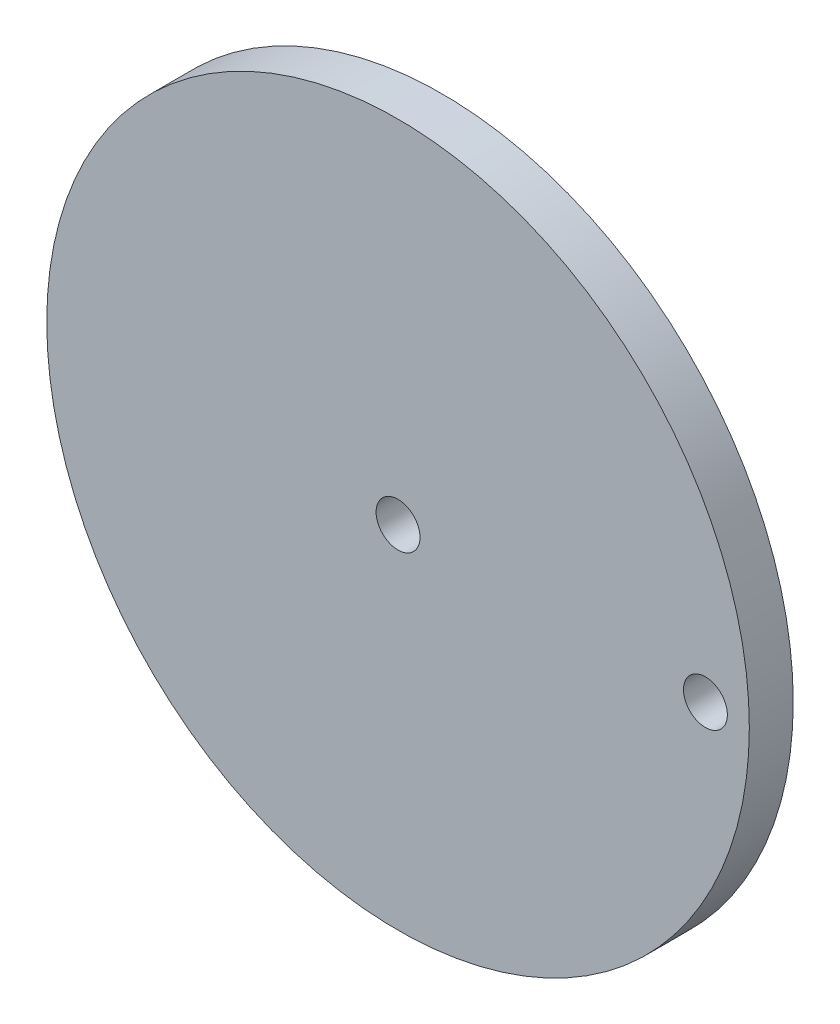
ISO-10303-21;
HEADER;
FILE_DESCRIPTION(('STEP AP214'),'2;1');
FILE_NAME('part.step','',(''),(''),'','','');
FILE_SCHEMA(('AUTOMOTIVE_DESIGN { 1 0 10303 214 1 1 1 1 }'));
ENDSEC;
DATA;
#1=APPLICATION_CONTEXT('core data for automotive mechanical design processes');
#2=APPLICATION_PROTOCOL_DEFINITION('international standard','automotive_design',2000,#1);
#3=PRODUCT_CONTEXT('',#1,'mechanical');
#4=PRODUCT('Part','Part','',(#3));
#5=PRODUCT_RELATED_PRODUCT_CATEGORY('part','',(#4));
#6=PRODUCT_DEFINITION_FORMATION('','',#4);
#7=PRODUCT_DEFINITION_CONTEXT('part definition',#1,'design');
#8=PRODUCT_DEFINITION('design','',#6,#7);
#9=PRODUCT_DEFINITION_SHAPE('','',#8);
#10=(LENGTH_UNIT() NAMED_UNIT(*) SI_UNIT(.MILLI.,.METRE.));
#11=(NAMED_UNIT(*) PLANE_ANGLE_UNIT() SI_UNIT($,.RADIAN.));
#12=(NAMED_UNIT(*) SI_UNIT($,.STERADIAN.) SOLID_ANGLE_UNIT());
#13=UNCERTAINTY_MEASURE_WITH_UNIT(LENGTH_MEASURE(1.E-05),#10,'distance_accuracy_value','');
#14=(GEOMETRIC_REPRESENTATION_CONTEXT(3) GLOBAL_UNCERTAINTY_ASSIGNED_CONTEXT((#13)) GLOBAL_UNIT_ASSIGNED_CONTEXT((#10,
#11,#12)) REPRESENTATION_CONTEXT('',''));
#15=CARTESIAN_POINT('',(0.,0.,0.));
#16=DIRECTION('',(0.,0.,1.));
#17=DIRECTION('',(1.,0.,0.));
#18=AXIS2_PLACEMENT_3D('',#15,#16,#17);
#19=CARTESIAN_POINT('',(0.,0.,5.));
#20=DIRECTION('',(0.,0.,-1.));
#21=DIRECTION('',(-1.,0.,0.));
#22=AXIS2_PLACEMENT_3D('',#19,#20,#21);
#23=CYLINDRICAL_SURFACE('',#22,2.5);
#24=CARTESIAN_POINT('',(0.,0.,5.));
#25=DIRECTION('',(0.,0.,1.));
#26=DIRECTION('',(1.,0.,0.));
#27=AXIS2_PLACEMENT_3D('',#24,#25,#26);
#28=CIRCLE('',#27,2.5);
#29=CARTESIAN_POINT('',(2.5,0.,5.));
#30=VERTEX_POINT('',#29);
#31=EDGE_CURVE('E51',#30,#30,#28,.T.);
#32=ORIENTED_EDGE('',*,*,#31,.T.);
#33=EDGE_LOOP('',(#32));
#34=FACE_BOUND('',#33,.T.);
#35=CARTESIAN_POINT('',(0.,0.,0.));
#36=DIRECTION('',(0.,0.,1.));
#37=DIRECTION('',(1.,0.,0.));
#38=AXIS2_PLACEMENT_3D('',#35,#36,#37);
#39=CIRCLE('',#38,2.5);
#40=CARTESIAN_POINT('',(2.5,0.,0.));
#41=VERTEX_POINT('',#40);
#42=EDGE_CURVE('E59',#41,#41,#39,.T.);
#43=ORIENTED_EDGE('',*,*,#42,.F.);
#44=EDGE_LOOP('',(#43));
#45=FACE_BOUND('',#44,.T.);
#46=ADVANCED_FACE('F43',(#34,#45),#23,.F.);
#47=CARTESIAN_POINT('',(35.,0.,5.));
#48=DIRECTION('',(0.,0.,-1.));
#49=DIRECTION('',(-1.,0.,0.));
#50=AXIS2_PLACEMENT_3D('',#47,#48,#49);
#51=CYLINDRICAL_SURFACE('',#50,2.5);
#52=CARTESIAN_POINT('',(35.,0.,5.));
#53=DIRECTION('',(0.,0.,1.));
#54=DIRECTION('',(1.,0.,0.));
#55=AXIS2_PLACEMENT_3D('',#52,#53,#54);
#56=CIRCLE('',#55,2.5);
#57=CARTESIAN_POINT('',(37.5,0.,5.));
#58=VERTEX_POINT('',#57);
#59=EDGE_CURVE('E10',#58,#58,#56,.T.);
#60=ORIENTED_EDGE('',*,*,#59,.T.);
#61=EDGE_LOOP('',(#60));
#62=FACE_BOUND('',#61,.T.);
#63=CARTESIAN_POINT('',(35.,0.,0.));
#64=DIRECTION('',(0.,0.,1.));
#65=DIRECTION('',(1.,0.,0.));
#66=AXIS2_PLACEMENT_3D('',#63,#64,#65);
#67=CIRCLE('',#66,2.5);
#68=CARTESIAN_POINT('',(37.5,0.,0.));
#69=VERTEX_POINT('',#68);
#70=EDGE_CURVE('E46',#69,#69,#67,.T.);
#71=ORIENTED_EDGE('',*,*,#70,.F.);
#72=EDGE_LOOP('',(#71));
#73=FACE_BOUND('',#72,.T.);
#74=ADVANCED_FACE('F91',(#62,#73),#51,.F.);
#75=CARTESIAN_POINT('',(0.,0.,5.));
#76=DIRECTION('',(0.,0.,1.));
#77=DIRECTION('',(1.,0.,0.));
#78=AXIS2_PLACEMENT_3D('',#75,#76,#77);
#79=PLANE('',#78);
#80=CARTESIAN_POINT('',(0.,0.,5.));
#81=DIRECTION('',(0.,0.,1.));
#82=DIRECTION('',(1.,0.,0.));
#83=AXIS2_PLACEMENT_3D('',#80,#81,#82);
#84=CIRCLE('',#83,40.);
#85=CARTESIAN_POINT('',(40.,0.,5.));
#86=VERTEX_POINT('',#85);
#87=EDGE_CURVE('E69',#86,#86,#84,.T.);
#88=ORIENTED_EDGE('',*,*,#87,.T.);
#89=EDGE_LOOP('',(#88));
#90=FACE_BOUND('',#89,.T.);
#91=ORIENTED_EDGE('',*,*,#31,.F.);
#92=EDGE_LOOP('',(#91));
#93=FACE_BOUND('',#92,.T.);
#94=ORIENTED_EDGE('',*,*,#59,.F.);
#95=EDGE_LOOP('',(#94));
#96=FACE_BOUND('',#95,.T.);
#97=ADVANCED_FACE('F77',(#90,#93,#96),#79,.T.);
#98=CARTESIAN_POINT('',(0.,0.,0.));
#99=DIRECTION('',(0.,0.,1.));
#100=DIRECTION('',(1.,0.,0.));
#101=AXIS2_PLACEMENT_3D('',#98,#99,#100);
#102=PLANE('',#101);
#103=CARTESIAN_POINT('',(0.,0.,0.));
#104=DIRECTION('',(0.,0.,1.));
#105=DIRECTION('',(1.,0.,0.));
#106=AXIS2_PLACEMENT_3D('',#103,#104,#105);
#107=CIRCLE('',#106,40.);
#108=CARTESIAN_POINT('',(40.,0.,0.));
#109=VERTEX_POINT('',#108);
#110=EDGE_CURVE('E62',#109,#109,#107,.T.);
#111=ORIENTED_EDGE('',*,*,#110,.F.);
#112=EDGE_LOOP('',(#111));
#113=FACE_BOUND('',#112,.T.);
#114=ORIENTED_EDGE('',*,*,#42,.T.);
#115=EDGE_LOOP('',(#114));
#116=FACE_BOUND('',#115,.T.);
#117=ORIENTED_EDGE('',*,*,#70,.T.);
#118=EDGE_LOOP('',(#117));
#119=FACE_BOUND('',#118,.T.);
#120=ADVANCED_FACE('F82',(#113,#116,#119),#102,.F.);
#121=CARTESIAN_POINT('',(0.,0.,0.));
#122=DIRECTION('',(0.,0.,1.));
#123=DIRECTION('',(1.,0.,0.));
#124=AXIS2_PLACEMENT_3D('',#121,#122,#123);
#125=CYLINDRICAL_SURFACE('',#124,40.);
#126=ORIENTED_EDGE('',*,*,#87,.F.);
#127=EDGE_LOOP('',(#126));
#128=FACE_BOUND('',#127,.T.);
#129=ORIENTED_EDGE('',*,*,#110,.T.);
#130=EDGE_LOOP('',(#129));
#131=FACE_BOUND('',#130,.T.);
#132=ADVANCED_FACE('F80',(#128,#131),#125,.T.);
#133=CLOSED_SHELL('',(#46,#74,#97,#120,#132));
#134=MANIFOLD_SOLID_BREP('B2',#133);
#135=ADVANCED_BREP_SHAPE_REPRESENTATION('',(#18,#134),#14);
#136=SHAPE_DEFINITION_REPRESENTATION(#9,#135);
ENDSEC;
END-ISO-10303-21;
